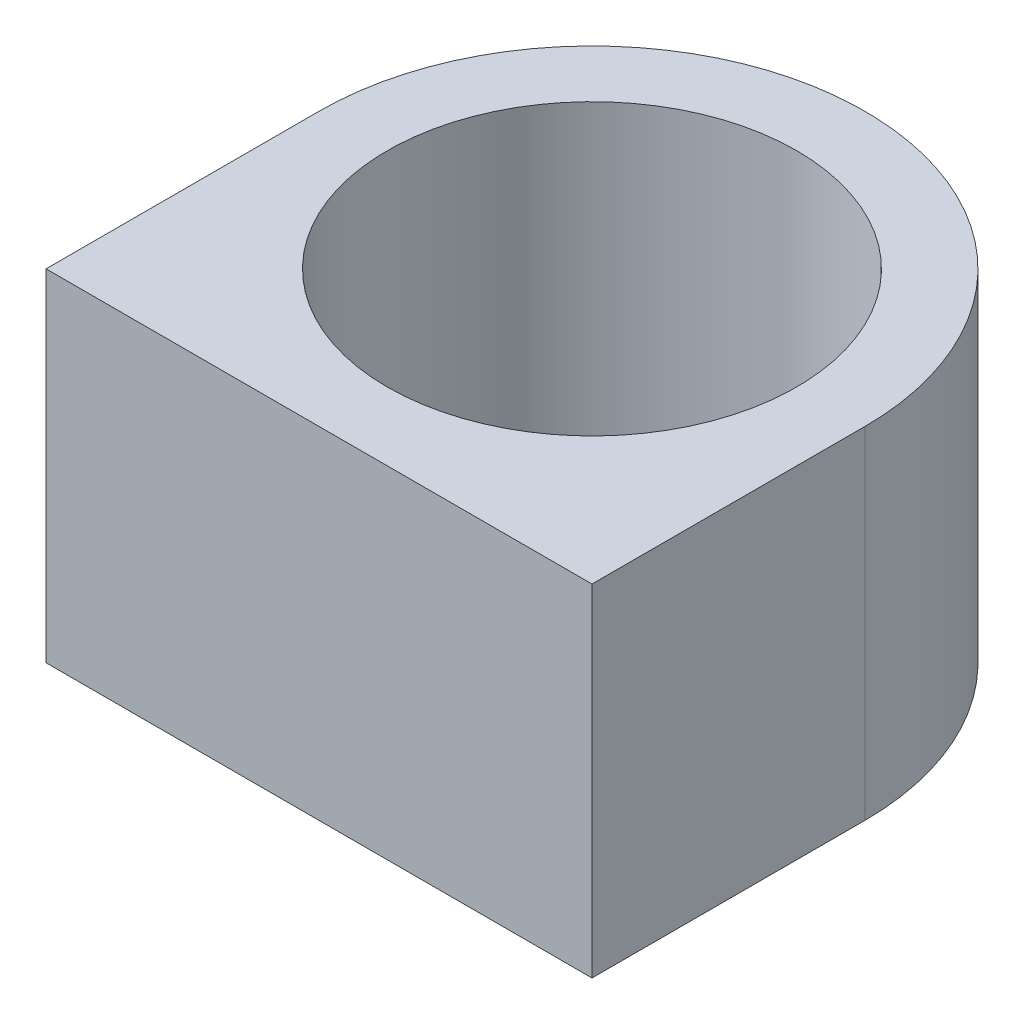
ISO-10303-21;
HEADER;
FILE_DESCRIPTION(('STEP AP214'),'2;1');
FILE_NAME('part.step','',(''),(''),'','','');
FILE_SCHEMA(('AUTOMOTIVE_DESIGN { 1 0 10303 214 1 1 1 1 }'));
ENDSEC;
DATA;
#1=APPLICATION_CONTEXT('core data for automotive mechanical design processes');
#2=APPLICATION_PROTOCOL_DEFINITION('international standard','automotive_design',2000,#1);
#3=PRODUCT_CONTEXT('',#1,'mechanical');
#4=PRODUCT('Part','Part','',(#3));
#5=PRODUCT_RELATED_PRODUCT_CATEGORY('part','',(#4));
#6=PRODUCT_DEFINITION_FORMATION('','',#4);
#7=PRODUCT_DEFINITION_CONTEXT('part definition',#1,'design');
#8=PRODUCT_DEFINITION('design','',#6,#7);
#9=PRODUCT_DEFINITION_SHAPE('','',#8);
#10=(LENGTH_UNIT() NAMED_UNIT(*) SI_UNIT(.MILLI.,.METRE.));
#11=(NAMED_UNIT(*) PLANE_ANGLE_UNIT() SI_UNIT($,.RADIAN.));
#12=(NAMED_UNIT(*) SI_UNIT($,.STERADIAN.) SOLID_ANGLE_UNIT());
#13=UNCERTAINTY_MEASURE_WITH_UNIT(LENGTH_MEASURE(1.E-05),#10,'distance_accuracy_value','');
#14=(GEOMETRIC_REPRESENTATION_CONTEXT(3) GLOBAL_UNCERTAINTY_ASSIGNED_CONTEXT((#13)) GLOBAL_UNIT_ASSIGNED_CONTEXT((#10,
#11,#12)) REPRESENTATION_CONTEXT('',''));
#15=CARTESIAN_POINT('',(0.,0.,0.));
#16=DIRECTION('',(0.,0.,1.));
#17=DIRECTION('',(1.,0.,0.));
#18=AXIS2_PLACEMENT_3D('',#15,#16,#17);
#19=CARTESIAN_POINT('',(0.,5.,0.));
#20=DIRECTION('',(0.,1.,0.));
#21=DIRECTION('',(0.,0.,1.));
#22=AXIS2_PLACEMENT_3D('',#19,#20,#21);
#23=PLANE('',#22);
#24=CARTESIAN_POINT('',(0.,5.,0.));
#25=DIRECTION('',(0.,1.,0.));
#26=DIRECTION('',(0.,0.,1.));
#27=AXIS2_PLACEMENT_3D('',#24,#25,#26);
#28=CIRCLE('',#27,4.);
#29=CARTESIAN_POINT('',(4.,5.,0.));
#30=VERTEX_POINT('',#29);
#31=CARTESIAN_POINT('',(-4.,5.,0.));
#32=VERTEX_POINT('',#31);
#33=EDGE_CURVE('E92',#30,#32,#28,.T.);
#34=ORIENTED_EDGE('',*,*,#33,.T.);
#35=DIRECTION('',(0.,0.,1.));
#36=VECTOR('',#35,1.);
#37=CARTESIAN_POINT('',(-4.,5.,4.));
#38=LINE('',#37,#36);
#39=CARTESIAN_POINT('',(-4.,5.,4.));
#40=VERTEX_POINT('',#39);
#41=EDGE_CURVE('E87',#32,#40,#38,.T.);
#42=ORIENTED_EDGE('',*,*,#41,.T.);
#43=DIRECTION('',(1.,0.,0.));
#44=VECTOR('',#43,1.);
#45=CARTESIAN_POINT('',(4.,5.,4.));
#46=LINE('',#45,#44);
#47=CARTESIAN_POINT('',(4.,5.,4.));
#48=VERTEX_POINT('',#47);
#49=EDGE_CURVE('E90',#40,#48,#46,.T.);
#50=ORIENTED_EDGE('',*,*,#49,.T.);
#51=DIRECTION('',(0.,0.,-1.));
#52=VECTOR('',#51,1.);
#53=CARTESIAN_POINT('',(4.,5.,0.));
#54=LINE('',#53,#52);
#55=EDGE_CURVE('E57',#48,#30,#54,.T.);
#56=ORIENTED_EDGE('',*,*,#55,.T.);
#57=EDGE_LOOP('',(#34,#42,#50,#56));
#58=FACE_BOUND('',#57,.T.);
#59=CARTESIAN_POINT('',(0.,5.,0.));
#60=DIRECTION('',(0.,1.,0.));
#61=DIRECTION('',(0.,0.,1.));
#62=AXIS2_PLACEMENT_3D('',#59,#60,#61);
#63=CIRCLE('',#62,3.);
#64=CARTESIAN_POINT('',(0.,5.,3.));
#65=VERTEX_POINT('',#64);
#66=EDGE_CURVE('E112',#65,#65,#63,.T.);
#67=ORIENTED_EDGE('',*,*,#66,.F.);
#68=EDGE_LOOP('',(#67));
#69=FACE_BOUND('',#68,.T.);
#70=ADVANCED_FACE('F39',(#58,#69),#23,.T.);
#71=CARTESIAN_POINT('',(0.,0.,0.));
#72=DIRECTION('',(0.,1.,0.));
#73=DIRECTION('',(0.,0.,1.));
#74=AXIS2_PLACEMENT_3D('',#71,#72,#73);
#75=PLANE('',#74);
#76=CARTESIAN_POINT('',(0.,0.,0.));
#77=DIRECTION('',(0.,1.,0.));
#78=DIRECTION('',(0.,0.,1.));
#79=AXIS2_PLACEMENT_3D('',#76,#77,#78);
#80=CIRCLE('',#79,4.);
#81=CARTESIAN_POINT('',(4.,0.,0.));
#82=VERTEX_POINT('',#81);
#83=CARTESIAN_POINT('',(-4.,0.,0.));
#84=VERTEX_POINT('',#83);
#85=EDGE_CURVE('E108',#82,#84,#80,.T.);
#86=ORIENTED_EDGE('',*,*,#85,.F.);
#87=DIRECTION('',(0.,0.,-1.));
#88=VECTOR('',#87,1.);
#89=CARTESIAN_POINT('',(4.,0.,0.));
#90=LINE('',#89,#88);
#91=CARTESIAN_POINT('',(4.,0.,4.));
#92=VERTEX_POINT('',#91);
#93=EDGE_CURVE('E80',#92,#82,#90,.T.);
#94=ORIENTED_EDGE('',*,*,#93,.F.);
#95=DIRECTION('',(1.,0.,0.));
#96=VECTOR('',#95,1.);
#97=CARTESIAN_POINT('',(4.,0.,4.));
#98=LINE('',#97,#96);
#99=CARTESIAN_POINT('',(-4.,0.,4.));
#100=VERTEX_POINT('',#99);
#101=EDGE_CURVE('E74',#100,#92,#98,.T.);
#102=ORIENTED_EDGE('',*,*,#101,.F.);
#103=DIRECTION('',(0.,0.,1.));
#104=VECTOR('',#103,1.);
#105=CARTESIAN_POINT('',(-4.,0.,4.));
#106=LINE('',#105,#104);
#107=EDGE_CURVE('E97',#84,#100,#106,.T.);
#108=ORIENTED_EDGE('',*,*,#107,.F.);
#109=EDGE_LOOP('',(#86,#94,#102,#108));
#110=FACE_BOUND('',#109,.T.);
#111=CARTESIAN_POINT('',(0.,0.,0.));
#112=DIRECTION('',(0.,1.,0.));
#113=DIRECTION('',(0.,0.,1.));
#114=AXIS2_PLACEMENT_3D('',#111,#112,#113);
#115=CIRCLE('',#114,3.);
#116=CARTESIAN_POINT('',(0.,0.,3.));
#117=VERTEX_POINT('',#116);
#118=EDGE_CURVE('E130',#117,#117,#115,.T.);
#119=ORIENTED_EDGE('',*,*,#118,.T.);
#120=EDGE_LOOP('',(#119));
#121=FACE_BOUND('',#120,.T.);
#122=ADVANCED_FACE('F125',(#110,#121),#75,.F.);
#123=CARTESIAN_POINT('',(0.,5.,0.));
#124=DIRECTION('',(0.,-1.,0.));
#125=DIRECTION('',(0.,0.,-1.));
#126=AXIS2_PLACEMENT_3D('',#123,#124,#125);
#127=CYLINDRICAL_SURFACE('',#126,4.);
#128=ORIENTED_EDGE('',*,*,#85,.T.);
#129=DIRECTION('',(0.,-1.,0.));
#130=VECTOR('',#129,1.);
#131=CARTESIAN_POINT('',(-4.,5.,0.));
#132=LINE('',#131,#130);
#133=EDGE_CURVE('E11',#32,#84,#132,.T.);
#134=ORIENTED_EDGE('',*,*,#133,.F.);
#135=ORIENTED_EDGE('',*,*,#33,.F.);
#136=DIRECTION('',(0.,-1.,0.));
#137=VECTOR('',#136,1.);
#138=CARTESIAN_POINT('',(4.,5.,0.));
#139=LINE('',#138,#137);
#140=EDGE_CURVE('E104',#30,#82,#139,.T.);
#141=ORIENTED_EDGE('',*,*,#140,.T.);
#142=EDGE_LOOP('',(#128,#134,#135,#141));
#143=FACE_BOUND('',#142,.T.);
#144=ADVANCED_FACE('F41',(#143),#127,.T.);
#145=CARTESIAN_POINT('',(-4.,5.,4.));
#146=DIRECTION('',(1.,0.,0.));
#147=DIRECTION('',(0.,0.,-1.));
#148=AXIS2_PLACEMENT_3D('',#145,#146,#147);
#149=PLANE('',#148);
#150=ORIENTED_EDGE('',*,*,#107,.T.);
#151=DIRECTION('',(0.,-1.,0.));
#152=VECTOR('',#151,1.);
#153=CARTESIAN_POINT('',(-4.,5.,4.));
#154=LINE('',#153,#152);
#155=EDGE_CURVE('E49',#40,#100,#154,.T.);
#156=ORIENTED_EDGE('',*,*,#155,.F.);
#157=ORIENTED_EDGE('',*,*,#41,.F.);
#158=ORIENTED_EDGE('',*,*,#133,.T.);
#159=EDGE_LOOP('',(#150,#156,#157,#158));
#160=FACE_BOUND('',#159,.T.);
#161=ADVANCED_FACE('F96',(#160),#149,.F.);
#162=CARTESIAN_POINT('',(4.,5.,4.));
#163=DIRECTION('',(0.,0.,-1.));
#164=DIRECTION('',(-1.,0.,0.));
#165=AXIS2_PLACEMENT_3D('',#162,#163,#164);
#166=PLANE('',#165);
#167=ORIENTED_EDGE('',*,*,#101,.T.);
#168=DIRECTION('',(0.,-1.,0.));
#169=VECTOR('',#168,1.);
#170=CARTESIAN_POINT('',(4.,5.,4.));
#171=LINE('',#170,#169);
#172=EDGE_CURVE('E99',#48,#92,#171,.T.);
#173=ORIENTED_EDGE('',*,*,#172,.F.);
#174=ORIENTED_EDGE('',*,*,#49,.F.);
#175=ORIENTED_EDGE('',*,*,#155,.T.);
#176=EDGE_LOOP('',(#167,#173,#174,#175));
#177=FACE_BOUND('',#176,.T.);
#178=ADVANCED_FACE('F100',(#177),#166,.F.);
#179=CARTESIAN_POINT('',(4.,5.,0.));
#180=DIRECTION('',(-1.,0.,0.));
#181=DIRECTION('',(0.,0.,1.));
#182=AXIS2_PLACEMENT_3D('',#179,#180,#181);
#183=PLANE('',#182);
#184=ORIENTED_EDGE('',*,*,#93,.T.);
#185=ORIENTED_EDGE('',*,*,#140,.F.);
#186=ORIENTED_EDGE('',*,*,#55,.F.);
#187=ORIENTED_EDGE('',*,*,#172,.T.);
#188=EDGE_LOOP('',(#184,#185,#186,#187));
#189=FACE_BOUND('',#188,.T.);
#190=ADVANCED_FACE('F122',(#189),#183,.F.);
#191=CARTESIAN_POINT('',(0.,5.,0.));
#192=DIRECTION('',(0.,-1.,0.));
#193=DIRECTION('',(0.,0.,-1.));
#194=AXIS2_PLACEMENT_3D('',#191,#192,#193);
#195=CYLINDRICAL_SURFACE('',#194,3.);
#196=ORIENTED_EDGE('',*,*,#66,.T.);
#197=EDGE_LOOP('',(#196));
#198=FACE_BOUND('',#197,.T.);
#199=ORIENTED_EDGE('',*,*,#118,.F.);
#200=EDGE_LOOP('',(#199));
#201=FACE_BOUND('',#200,.T.);
#202=ADVANCED_FACE('F138',(#198,#201),#195,.F.);
#203=CLOSED_SHELL('',(#70,#122,#144,#161,#178,#190,#202));
#204=MANIFOLD_SOLID_BREP('B2',#203);
#205=ADVANCED_BREP_SHAPE_REPRESENTATION('',(#18,#204),#14);
#206=SHAPE_DEFINITION_REPRESENTATION(#9,#205);
ENDSEC;
END-ISO-10303-21;
